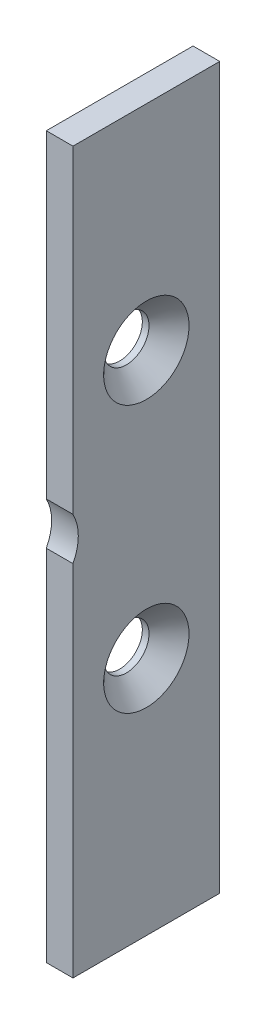
ISO-10303-21;
HEADER;
FILE_DESCRIPTION(('STEP AP214'),'2;1');
FILE_NAME('part.step','',(''),(''),'','','');
FILE_SCHEMA(('AUTOMOTIVE_DESIGN { 1 0 10303 214 1 1 1 1 }'));
ENDSEC;
DATA;
#1=APPLICATION_CONTEXT('core data for automotive mechanical design processes');
#2=APPLICATION_PROTOCOL_DEFINITION('international standard','automotive_design',2000,#1);
#3=PRODUCT_CONTEXT('',#1,'mechanical');
#4=PRODUCT('Part','Part','',(#3));
#5=PRODUCT_RELATED_PRODUCT_CATEGORY('part','',(#4));
#6=PRODUCT_DEFINITION_FORMATION('','',#4);
#7=PRODUCT_DEFINITION_CONTEXT('part definition',#1,'design');
#8=PRODUCT_DEFINITION('design','',#6,#7);
#9=PRODUCT_DEFINITION_SHAPE('','',#8);
#10=(LENGTH_UNIT() NAMED_UNIT(*) SI_UNIT(.MILLI.,.METRE.));
#11=(NAMED_UNIT(*) PLANE_ANGLE_UNIT() SI_UNIT($,.RADIAN.));
#12=(NAMED_UNIT(*) SI_UNIT($,.STERADIAN.) SOLID_ANGLE_UNIT());
#13=UNCERTAINTY_MEASURE_WITH_UNIT(LENGTH_MEASURE(1.E-05),#10,'distance_accuracy_value','');
#14=(GEOMETRIC_REPRESENTATION_CONTEXT(3) GLOBAL_UNCERTAINTY_ASSIGNED_CONTEXT((#13)) GLOBAL_UNIT_ASSIGNED_CONTEXT((#10,
#11,#12)) REPRESENTATION_CONTEXT('',''));
#15=CARTESIAN_POINT('',(0.,0.,0.));
#16=DIRECTION('',(0.,0.,1.));
#17=DIRECTION('',(1.,0.,0.));
#18=AXIS2_PLACEMENT_3D('',#15,#16,#17);
#19=CARTESIAN_POINT('',(0.,0.,-22.5));
#20=DIRECTION('',(0.,0.,1.));
#21=DIRECTION('',(1.,0.,0.));
#22=AXIS2_PLACEMENT_3D('',#19,#20,#21);
#23=PLANE('',#22);
#24=DIRECTION('',(0.,1.,0.));
#25=VECTOR('',#24,1.);
#26=CARTESIAN_POINT('',(58.2,0.5,-22.5));
#27=LINE('',#26,#25);
#28=CARTESIAN_POINT('',(58.2,0.5,-22.5));
#29=VERTEX_POINT('',#28);
#30=CARTESIAN_POINT('',(58.2,27.4,-22.5));
#31=VERTEX_POINT('',#30);
#32=EDGE_CURVE('E145',#29,#31,#27,.T.);
#33=ORIENTED_EDGE('',*,*,#32,.F.);
#34=DIRECTION('',(-1.,0.,0.));
#35=VECTOR('',#34,1.);
#36=CARTESIAN_POINT('',(60.2,0.5,-22.5));
#37=LINE('',#36,#35);
#38=CARTESIAN_POINT('',(60.2,0.5,-22.5));
#39=VERTEX_POINT('',#38);
#40=EDGE_CURVE('E122',#39,#29,#37,.T.);
#41=ORIENTED_EDGE('',*,*,#40,.F.);
#42=DIRECTION('',(0.,-1.,0.));
#43=VECTOR('',#42,1.);
#44=CARTESIAN_POINT('',(60.2,54.5,-22.5));
#45=LINE('',#44,#43);
#46=CARTESIAN_POINT('',(60.2,27.4,-22.5));
#47=VERTEX_POINT('',#46);
#48=EDGE_CURVE('E125',#47,#39,#45,.T.);
#49=ORIENTED_EDGE('',*,*,#48,.F.);
#50=DIRECTION('',(-1.,0.,0.));
#51=VECTOR('',#50,1.);
#52=CARTESIAN_POINT('',(60.3,27.4,-22.5));
#53=LINE('',#52,#51);
#54=EDGE_CURVE('E11',#31,#47,#53,.F.);
#55=ORIENTED_EDGE('',*,*,#54,.F.);
#56=EDGE_LOOP('',(#33,#41,#49,#55));
#57=FACE_BOUND('',#56,.T.);
#58=ADVANCED_FACE('F41',(#57),#23,.T.);
#59=CARTESIAN_POINT('',(60.2,54.5,-22.5));
#60=VERTEX_POINT('',#59);
#61=CARTESIAN_POINT('',(60.2,30.6,-22.5));
#62=VERTEX_POINT('',#61);
#63=EDGE_CURVE('E116',#60,#62,#45,.T.);
#64=ORIENTED_EDGE('',*,*,#63,.F.);
#65=DIRECTION('',(1.,0.,0.));
#66=VECTOR('',#65,1.);
#67=CARTESIAN_POINT('',(58.2,54.5,-22.5));
#68=LINE('',#67,#66);
#69=CARTESIAN_POINT('',(58.2,54.5,-22.5));
#70=VERTEX_POINT('',#69);
#71=EDGE_CURVE('E123',#70,#60,#68,.T.);
#72=ORIENTED_EDGE('',*,*,#71,.F.);
#73=CARTESIAN_POINT('',(58.2,30.6,-22.5));
#74=VERTEX_POINT('',#73);
#75=EDGE_CURVE('E120',#74,#70,#27,.T.);
#76=ORIENTED_EDGE('',*,*,#75,.F.);
#77=DIRECTION('',(-1.,0.,0.));
#78=VECTOR('',#77,1.);
#79=CARTESIAN_POINT('',(60.3,30.6,-22.5));
#80=LINE('',#79,#78);
#81=EDGE_CURVE('E47',#62,#74,#80,.T.);
#82=ORIENTED_EDGE('',*,*,#81,.F.);
#83=EDGE_LOOP('',(#64,#72,#76,#82));
#84=FACE_BOUND('',#83,.T.);
#85=ADVANCED_FACE('F112',(#84),#23,.T.);
#86=CARTESIAN_POINT('',(58.2,0.5,-22.5));
#87=DIRECTION('',(1.,0.,0.));
#88=DIRECTION('',(0.,0.,-1.));
#89=AXIS2_PLACEMENT_3D('',#86,#87,#88);
#90=PLANE('',#89);
#91=CARTESIAN_POINT('',(58.2,38.5,-28.));
#92=DIRECTION('',(-1.,0.,0.));
#93=DIRECTION('',(0.,0.,-1.));
#94=AXIS2_PLACEMENT_3D('',#91,#92,#93);
#95=CIRCLE('',#94,1.7);
#96=CARTESIAN_POINT('',(58.2,38.5,-29.7));
#97=VERTEX_POINT('',#96);
#98=EDGE_CURVE('E153',#97,#97,#95,.F.);
#99=ORIENTED_EDGE('',*,*,#98,.T.);
#100=EDGE_LOOP('',(#99));
#101=FACE_BOUND('',#100,.T.);
#102=CARTESIAN_POINT('',(58.2,18.5,-28.));
#103=DIRECTION('',(-1.,0.,0.));
#104=DIRECTION('',(0.,0.,-1.));
#105=AXIS2_PLACEMENT_3D('',#102,#103,#104);
#106=CIRCLE('',#105,1.7);
#107=CARTESIAN_POINT('',(58.2,18.5,-29.7));
#108=VERTEX_POINT('',#107);
#109=EDGE_CURVE('E109',#108,#108,#106,.F.);
#110=ORIENTED_EDGE('',*,*,#109,.T.);
#111=EDGE_LOOP('',(#110));
#112=FACE_BOUND('',#111,.T.);
#113=CARTESIAN_POINT('',(58.2,29.,-19.5));
#114=DIRECTION('',(-1.,0.,0.));
#115=DIRECTION('',(0.,0.,-1.));
#116=AXIS2_PLACEMENT_3D('',#113,#114,#115);
#117=CIRCLE('',#116,3.4);
#118=EDGE_CURVE('E57',#31,#74,#117,.F.);
#119=ORIENTED_EDGE('',*,*,#118,.T.);
#120=ORIENTED_EDGE('',*,*,#75,.T.);
#121=DIRECTION('',(0.,0.,-1.));
#122=VECTOR('',#121,1.);
#123=CARTESIAN_POINT('',(58.2,54.5,-22.5));
#124=LINE('',#123,#122);
#125=CARTESIAN_POINT('',(58.2,54.5,-33.5));
#126=VERTEX_POINT('',#125);
#127=EDGE_CURVE('E92',#70,#126,#124,.T.);
#128=ORIENTED_EDGE('',*,*,#127,.T.);
#129=DIRECTION('',(0.,1.,0.));
#130=VECTOR('',#129,1.);
#131=CARTESIAN_POINT('',(58.2,0.5,-33.5));
#132=LINE('',#131,#130);
#133=CARTESIAN_POINT('',(58.2,0.5,-33.5));
#134=VERTEX_POINT('',#133);
#135=EDGE_CURVE('E126',#134,#126,#132,.T.);
#136=ORIENTED_EDGE('',*,*,#135,.F.);
#137=DIRECTION('',(0.,0.,-1.));
#138=VECTOR('',#137,1.);
#139=CARTESIAN_POINT('',(58.2,0.5,-22.5));
#140=LINE('',#139,#138);
#141=EDGE_CURVE('E64',#29,#134,#140,.T.);
#142=ORIENTED_EDGE('',*,*,#141,.F.);
#143=ORIENTED_EDGE('',*,*,#32,.T.);
#144=EDGE_LOOP('',(#119,#120,#128,#136,#142,#143));
#145=FACE_BOUND('',#144,.T.);
#146=ADVANCED_FACE('F43',(#101,#112,#145),#90,.F.);
#147=CARTESIAN_POINT('',(58.2,54.5,-22.5));
#148=DIRECTION('',(0.,-1.,0.));
#149=DIRECTION('',(0.,0.,1.));
#150=AXIS2_PLACEMENT_3D('',#147,#148,#149);
#151=PLANE('',#150);
#152=DIRECTION('',(1.,0.,0.));
#153=VECTOR('',#152,1.);
#154=CARTESIAN_POINT('',(58.2,54.5,-33.5));
#155=LINE('',#154,#153);
#156=CARTESIAN_POINT('',(60.2,54.5,-33.5));
#157=VERTEX_POINT('',#156);
#158=EDGE_CURVE('E134',#126,#157,#155,.T.);
#159=ORIENTED_EDGE('',*,*,#158,.F.);
#160=ORIENTED_EDGE('',*,*,#127,.F.);
#161=ORIENTED_EDGE('',*,*,#71,.T.);
#162=DIRECTION('',(0.,0.,-1.));
#163=VECTOR('',#162,1.);
#164=CARTESIAN_POINT('',(60.2,54.5,-22.5));
#165=LINE('',#164,#163);
#166=EDGE_CURVE('E119',#60,#157,#165,.T.);
#167=ORIENTED_EDGE('',*,*,#166,.T.);
#168=EDGE_LOOP('',(#159,#160,#161,#167));
#169=FACE_BOUND('',#168,.T.);
#170=ADVANCED_FACE('F176',(#169),#151,.F.);
#171=CARTESIAN_POINT('',(60.2,54.5,-22.5));
#172=DIRECTION('',(-1.,0.,0.));
#173=DIRECTION('',(0.,0.,1.));
#174=AXIS2_PLACEMENT_3D('',#171,#172,#173);
#175=PLANE('',#174);
#176=CARTESIAN_POINT('',(60.2,38.5,-28.));
#177=DIRECTION('',(-1.,0.,0.));
#178=DIRECTION('',(0.,0.,-1.));
#179=AXIS2_PLACEMENT_3D('',#176,#177,#178);
#180=CIRCLE('',#179,3.2);
#181=CARTESIAN_POINT('',(60.2,38.5,-31.2));
#182=VERTEX_POINT('',#181);
#183=EDGE_CURVE('E160',#182,#182,#180,.T.);
#184=ORIENTED_EDGE('',*,*,#183,.T.);
#185=EDGE_LOOP('',(#184));
#186=FACE_BOUND('',#185,.T.);
#187=CARTESIAN_POINT('',(60.2,18.5,-28.));
#188=DIRECTION('',(-1.,0.,0.));
#189=DIRECTION('',(0.,0.,-1.));
#190=AXIS2_PLACEMENT_3D('',#187,#188,#189);
#191=CIRCLE('',#190,3.2);
#192=CARTESIAN_POINT('',(60.2,18.5,-31.2));
#193=VERTEX_POINT('',#192);
#194=EDGE_CURVE('E149',#193,#193,#191,.T.);
#195=ORIENTED_EDGE('',*,*,#194,.T.);
#196=EDGE_LOOP('',(#195));
#197=FACE_BOUND('',#196,.T.);
#198=CARTESIAN_POINT('',(60.2,29.,-19.5));
#199=DIRECTION('',(1.,0.,0.));
#200=DIRECTION('',(0.,0.,1.));
#201=AXIS2_PLACEMENT_3D('',#198,#199,#200);
#202=CIRCLE('',#201,3.4);
#203=EDGE_CURVE('E103',#62,#47,#202,.F.);
#204=ORIENTED_EDGE('',*,*,#203,.T.);
#205=ORIENTED_EDGE('',*,*,#48,.T.);
#206=DIRECTION('',(0.,0.,-1.));
#207=VECTOR('',#206,1.);
#208=CARTESIAN_POINT('',(60.2,0.5,-22.5));
#209=LINE('',#208,#207);
#210=CARTESIAN_POINT('',(60.2,0.5,-33.5));
#211=VERTEX_POINT('',#210);
#212=EDGE_CURVE('E138',#39,#211,#209,.T.);
#213=ORIENTED_EDGE('',*,*,#212,.T.);
#214=DIRECTION('',(0.,-1.,0.));
#215=VECTOR('',#214,1.);
#216=CARTESIAN_POINT('',(60.2,54.5,-33.5));
#217=LINE('',#216,#215);
#218=EDGE_CURVE('E133',#157,#211,#217,.T.);
#219=ORIENTED_EDGE('',*,*,#218,.F.);
#220=ORIENTED_EDGE('',*,*,#166,.F.);
#221=ORIENTED_EDGE('',*,*,#63,.T.);
#222=EDGE_LOOP('',(#204,#205,#213,#219,#220,#221));
#223=FACE_BOUND('',#222,.T.);
#224=ADVANCED_FACE('F117',(#186,#197,#223),#175,.F.);
#225=CARTESIAN_POINT('',(60.2,0.5,-22.5));
#226=DIRECTION('',(0.,1.,0.));
#227=DIRECTION('',(0.,0.,-1.));
#228=AXIS2_PLACEMENT_3D('',#225,#226,#227);
#229=PLANE('',#228);
#230=DIRECTION('',(-1.,0.,0.));
#231=VECTOR('',#230,1.);
#232=CARTESIAN_POINT('',(60.2,0.5,-33.5));
#233=LINE('',#232,#231);
#234=EDGE_CURVE('E83',#211,#134,#233,.T.);
#235=ORIENTED_EDGE('',*,*,#234,.F.);
#236=ORIENTED_EDGE('',*,*,#212,.F.);
#237=ORIENTED_EDGE('',*,*,#40,.T.);
#238=ORIENTED_EDGE('',*,*,#141,.T.);
#239=EDGE_LOOP('',(#235,#236,#237,#238));
#240=FACE_BOUND('',#239,.T.);
#241=ADVANCED_FACE('F202',(#240),#229,.F.);
#242=CARTESIAN_POINT('',(0.,0.,-33.5));
#243=DIRECTION('',(0.,0.,1.));
#244=DIRECTION('',(1.,0.,0.));
#245=AXIS2_PLACEMENT_3D('',#242,#243,#244);
#246=PLANE('',#245);
#247=ORIENTED_EDGE('',*,*,#135,.T.);
#248=ORIENTED_EDGE('',*,*,#158,.T.);
#249=ORIENTED_EDGE('',*,*,#218,.T.);
#250=ORIENTED_EDGE('',*,*,#234,.T.);
#251=EDGE_LOOP('',(#247,#248,#249,#250));
#252=FACE_BOUND('',#251,.T.);
#253=ADVANCED_FACE('F186',(#252),#246,.F.);
#254=CARTESIAN_POINT('',(60.3,29.,-19.5));
#255=DIRECTION('',(-1.,0.,0.));
#256=DIRECTION('',(0.,0.,1.));
#257=AXIS2_PLACEMENT_3D('',#254,#255,#256);
#258=CYLINDRICAL_SURFACE('',#257,3.4);
#259=ORIENTED_EDGE('',*,*,#118,.F.);
#260=ORIENTED_EDGE('',*,*,#54,.T.);
#261=ORIENTED_EDGE('',*,*,#203,.F.);
#262=ORIENTED_EDGE('',*,*,#81,.T.);
#263=EDGE_LOOP('',(#259,#260,#261,#262));
#264=FACE_BOUND('',#263,.T.);
#265=ADVANCED_FACE('F101',(#264),#258,.F.);
#266=CARTESIAN_POINT('',(58.,18.5,-28.));
#267=DIRECTION('',(1.,0.,0.));
#268=DIRECTION('',(0.,0.,-1.));
#269=AXIS2_PLACEMENT_3D('',#266,#267,#268);
#270=CYLINDRICAL_SURFACE('',#269,1.7);
#271=CARTESIAN_POINT('',(58.7,18.5,-28.));
#272=DIRECTION('',(-1.,0.,0.));
#273=DIRECTION('',(0.,0.,-1.));
#274=AXIS2_PLACEMENT_3D('',#271,#272,#273);
#275=CIRCLE('',#274,1.7);
#276=CARTESIAN_POINT('',(58.7,18.5,-29.7));
#277=VERTEX_POINT('',#276);
#278=EDGE_CURVE('E154',#277,#277,#275,.T.);
#279=ORIENTED_EDGE('',*,*,#278,.F.);
#280=EDGE_LOOP('',(#279));
#281=FACE_BOUND('',#280,.T.);
#282=ORIENTED_EDGE('',*,*,#109,.F.);
#283=EDGE_LOOP('',(#282));
#284=FACE_BOUND('',#283,.T.);
#285=ADVANCED_FACE('F177',(#281,#284),#270,.F.);
#286=CARTESIAN_POINT('',(60.2,18.5,-28.));
#287=DIRECTION('',(1.,0.,0.));
#288=DIRECTION('',(0.,0.,-1.));
#289=AXIS2_PLACEMENT_3D('',#286,#287,#288);
#290=CONICAL_SURFACE('',#289,3.2,0.785398163397448);
#291=ORIENTED_EDGE('',*,*,#278,.T.);
#292=EDGE_LOOP('',(#291));
#293=FACE_BOUND('',#292,.T.);
#294=ORIENTED_EDGE('',*,*,#194,.F.);
#295=EDGE_LOOP('',(#294));
#296=FACE_BOUND('',#295,.T.);
#297=ADVANCED_FACE('F167',(#293,#296),#290,.F.);
#298=CARTESIAN_POINT('',(58.,38.5,-28.));
#299=DIRECTION('',(1.,0.,0.));
#300=DIRECTION('',(0.,0.,-1.));
#301=AXIS2_PLACEMENT_3D('',#298,#299,#300);
#302=CYLINDRICAL_SURFACE('',#301,1.7);
#303=CARTESIAN_POINT('',(58.7,38.5,-28.));
#304=DIRECTION('',(-1.,0.,0.));
#305=DIRECTION('',(0.,0.,-1.));
#306=AXIS2_PLACEMENT_3D('',#303,#304,#305);
#307=CIRCLE('',#306,1.7);
#308=CARTESIAN_POINT('',(58.7,38.5,-29.7));
#309=VERTEX_POINT('',#308);
#310=EDGE_CURVE('E156',#309,#309,#307,.T.);
#311=ORIENTED_EDGE('',*,*,#310,.F.);
#312=EDGE_LOOP('',(#311));
#313=FACE_BOUND('',#312,.T.);
#314=ORIENTED_EDGE('',*,*,#98,.F.);
#315=EDGE_LOOP('',(#314));
#316=FACE_BOUND('',#315,.T.);
#317=ADVANCED_FACE('F170',(#313,#316),#302,.F.);
#318=CARTESIAN_POINT('',(60.2,38.5,-28.));
#319=DIRECTION('',(1.,0.,0.));
#320=DIRECTION('',(0.,0.,-1.));
#321=AXIS2_PLACEMENT_3D('',#318,#319,#320);
#322=CONICAL_SURFACE('',#321,3.2,0.785398163397448);
#323=ORIENTED_EDGE('',*,*,#310,.T.);
#324=EDGE_LOOP('',(#323));
#325=FACE_BOUND('',#324,.T.);
#326=ORIENTED_EDGE('',*,*,#183,.F.);
#327=EDGE_LOOP('',(#326));
#328=FACE_BOUND('',#327,.T.);
#329=ADVANCED_FACE('F165',(#325,#328),#322,.F.);
#330=CLOSED_SHELL('',(#58,#85,#146,#170,#224,#241,#253,#265,#285,#297,#317,#329));
#331=MANIFOLD_SOLID_BREP('B2',#330);
#332=ADVANCED_BREP_SHAPE_REPRESENTATION('',(#18,#331),#14);
#333=SHAPE_DEFINITION_REPRESENTATION(#9,#332);
ENDSEC;
END-ISO-10303-21;
